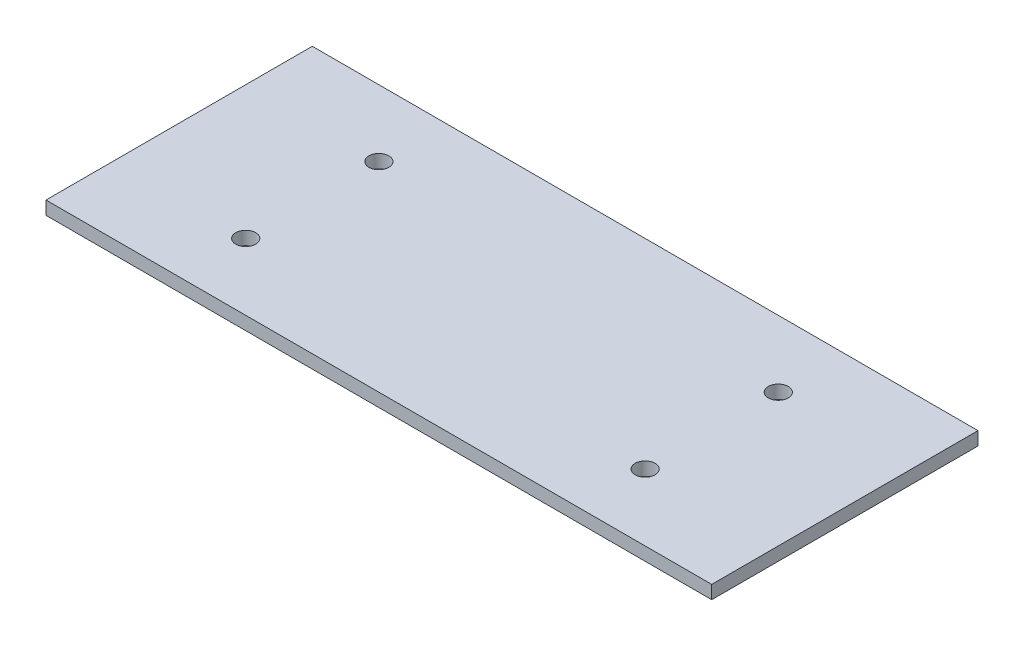
ISO-10303-21;
HEADER;
FILE_DESCRIPTION(('STEP AP214'),'2;1');
FILE_NAME('part.step','',(''),(''),'','','');
FILE_SCHEMA(('AUTOMOTIVE_DESIGN { 1 0 10303 214 1 1 1 1 }'));
ENDSEC;
DATA;
#1=APPLICATION_CONTEXT('core data for automotive mechanical design processes');
#2=APPLICATION_PROTOCOL_DEFINITION('international standard','automotive_design',2000,#1);
#3=PRODUCT_CONTEXT('',#1,'mechanical');
#4=PRODUCT('Part','Part','',(#3));
#5=PRODUCT_RELATED_PRODUCT_CATEGORY('part','',(#4));
#6=PRODUCT_DEFINITION_FORMATION('','',#4);
#7=PRODUCT_DEFINITION_CONTEXT('part definition',#1,'design');
#8=PRODUCT_DEFINITION('design','',#6,#7);
#9=PRODUCT_DEFINITION_SHAPE('','',#8);
#10=(LENGTH_UNIT() NAMED_UNIT(*) SI_UNIT(.MILLI.,.METRE.));
#11=(NAMED_UNIT(*) PLANE_ANGLE_UNIT() SI_UNIT($,.RADIAN.));
#12=(NAMED_UNIT(*) SI_UNIT($,.STERADIAN.) SOLID_ANGLE_UNIT());
#13=UNCERTAINTY_MEASURE_WITH_UNIT(LENGTH_MEASURE(1.E-05),#10,'distance_accuracy_value','');
#14=(GEOMETRIC_REPRESENTATION_CONTEXT(3) GLOBAL_UNCERTAINTY_ASSIGNED_CONTEXT((#13)) GLOBAL_UNIT_ASSIGNED_CONTEXT((#10,
#11,#12)) REPRESENTATION_CONTEXT('',''));
#15=CARTESIAN_POINT('',(0.,0.,0.));
#16=DIRECTION('',(0.,0.,1.));
#17=DIRECTION('',(1.,0.,0.));
#18=AXIS2_PLACEMENT_3D('',#15,#16,#17);
#19=CARTESIAN_POINT('',(0.,2.,-40.));
#20=DIRECTION('',(0.,0.,1.));
#21=DIRECTION('',(1.,0.,0.));
#22=AXIS2_PLACEMENT_3D('',#19,#20,#21);
#23=PLANE('',#22);
#24=DIRECTION('',(-1.,0.,0.));
#25=VECTOR('',#24,1.);
#26=CARTESIAN_POINT('',(0.,0.,-40.));
#27=LINE('',#26,#25);
#28=CARTESIAN_POINT('',(100.,0.,-40.));
#29=VERTEX_POINT('',#28);
#30=CARTESIAN_POINT('',(0.,0.,-40.));
#31=VERTEX_POINT('',#30);
#32=EDGE_CURVE('E127',#29,#31,#27,.T.);
#33=ORIENTED_EDGE('',*,*,#32,.T.);
#34=DIRECTION('',(0.,-1.,0.));
#35=VECTOR('',#34,1.);
#36=CARTESIAN_POINT('',(0.,2.,-40.));
#37=LINE('',#36,#35);
#38=CARTESIAN_POINT('',(0.,2.,-40.));
#39=VERTEX_POINT('',#38);
#40=EDGE_CURVE('E11',#39,#31,#37,.T.);
#41=ORIENTED_EDGE('',*,*,#40,.F.);
#42=DIRECTION('',(-1.,0.,0.));
#43=VECTOR('',#42,1.);
#44=CARTESIAN_POINT('',(0.,2.,-40.));
#45=LINE('',#44,#43);
#46=CARTESIAN_POINT('',(100.,2.,-40.));
#47=VERTEX_POINT('',#46);
#48=EDGE_CURVE('E95',#47,#39,#45,.T.);
#49=ORIENTED_EDGE('',*,*,#48,.F.);
#50=DIRECTION('',(0.,-1.,0.));
#51=VECTOR('',#50,1.);
#52=CARTESIAN_POINT('',(100.,2.,-40.));
#53=LINE('',#52,#51);
#54=EDGE_CURVE('E114',#47,#29,#53,.T.);
#55=ORIENTED_EDGE('',*,*,#54,.T.);
#56=EDGE_LOOP('',(#33,#41,#49,#55));
#57=FACE_BOUND('',#56,.T.);
#58=ADVANCED_FACE('F41',(#57),#23,.F.);
#59=CARTESIAN_POINT('',(0.,2.,0.));
#60=DIRECTION('',(1.,0.,0.));
#61=DIRECTION('',(0.,0.,-1.));
#62=AXIS2_PLACEMENT_3D('',#59,#60,#61);
#63=PLANE('',#62);
#64=DIRECTION('',(0.,0.,1.));
#65=VECTOR('',#64,1.);
#66=CARTESIAN_POINT('',(0.,0.,0.));
#67=LINE('',#66,#65);
#68=CARTESIAN_POINT('',(0.,0.,0.));
#69=VERTEX_POINT('',#68);
#70=EDGE_CURVE('E100',#31,#69,#67,.T.);
#71=ORIENTED_EDGE('',*,*,#70,.T.);
#72=DIRECTION('',(0.,-1.,0.));
#73=VECTOR('',#72,1.);
#74=CARTESIAN_POINT('',(0.,2.,0.));
#75=LINE('',#74,#73);
#76=CARTESIAN_POINT('',(0.,2.,0.));
#77=VERTEX_POINT('',#76);
#78=EDGE_CURVE('E51',#77,#69,#75,.T.);
#79=ORIENTED_EDGE('',*,*,#78,.F.);
#80=DIRECTION('',(0.,0.,1.));
#81=VECTOR('',#80,1.);
#82=CARTESIAN_POINT('',(0.,2.,0.));
#83=LINE('',#82,#81);
#84=EDGE_CURVE('E89',#39,#77,#83,.T.);
#85=ORIENTED_EDGE('',*,*,#84,.F.);
#86=ORIENTED_EDGE('',*,*,#40,.T.);
#87=EDGE_LOOP('',(#71,#79,#85,#86));
#88=FACE_BOUND('',#87,.T.);
#89=ADVANCED_FACE('F99',(#88),#63,.F.);
#90=CARTESIAN_POINT('',(0.,2.,0.));
#91=DIRECTION('',(0.,0.,-1.));
#92=DIRECTION('',(-1.,0.,0.));
#93=AXIS2_PLACEMENT_3D('',#90,#91,#92);
#94=PLANE('',#93);
#95=DIRECTION('',(1.,0.,0.));
#96=VECTOR('',#95,1.);
#97=CARTESIAN_POINT('',(0.,0.,0.));
#98=LINE('',#97,#96);
#99=CARTESIAN_POINT('',(100.,0.,0.));
#100=VERTEX_POINT('',#99);
#101=EDGE_CURVE('E76',#69,#100,#98,.T.);
#102=ORIENTED_EDGE('',*,*,#101,.T.);
#103=DIRECTION('',(0.,-1.,0.));
#104=VECTOR('',#103,1.);
#105=CARTESIAN_POINT('',(100.,2.,0.));
#106=LINE('',#105,#104);
#107=CARTESIAN_POINT('',(100.,2.,0.));
#108=VERTEX_POINT('',#107);
#109=EDGE_CURVE('E102',#108,#100,#106,.T.);
#110=ORIENTED_EDGE('',*,*,#109,.F.);
#111=DIRECTION('',(1.,0.,0.));
#112=VECTOR('',#111,1.);
#113=CARTESIAN_POINT('',(0.,2.,0.));
#114=LINE('',#113,#112);
#115=EDGE_CURVE('E93',#77,#108,#114,.T.);
#116=ORIENTED_EDGE('',*,*,#115,.F.);
#117=ORIENTED_EDGE('',*,*,#78,.T.);
#118=EDGE_LOOP('',(#102,#110,#116,#117));
#119=FACE_BOUND('',#118,.T.);
#120=ADVANCED_FACE('F103',(#119),#94,.F.);
#121=CARTESIAN_POINT('',(100.,2.,0.));
#122=DIRECTION('',(-1.,0.,0.));
#123=DIRECTION('',(0.,0.,1.));
#124=AXIS2_PLACEMENT_3D('',#121,#122,#123);
#125=PLANE('',#124);
#126=DIRECTION('',(0.,0.,-1.));
#127=VECTOR('',#126,1.);
#128=CARTESIAN_POINT('',(100.,0.,0.));
#129=LINE('',#128,#127);
#130=EDGE_CURVE('E82',#100,#29,#129,.T.);
#131=ORIENTED_EDGE('',*,*,#130,.T.);
#132=ORIENTED_EDGE('',*,*,#54,.F.);
#133=DIRECTION('',(0.,0.,-1.));
#134=VECTOR('',#133,1.);
#135=CARTESIAN_POINT('',(100.,2.,0.));
#136=LINE('',#135,#134);
#137=EDGE_CURVE('E59',#108,#47,#136,.T.);
#138=ORIENTED_EDGE('',*,*,#137,.F.);
#139=ORIENTED_EDGE('',*,*,#109,.T.);
#140=EDGE_LOOP('',(#131,#132,#138,#139));
#141=FACE_BOUND('',#140,.T.);
#142=ADVANCED_FACE('F145',(#141),#125,.F.);
#143=CARTESIAN_POINT('',(20.,2.,-30.));
#144=DIRECTION('',(0.,-1.,0.));
#145=DIRECTION('',(0.,0.,-1.));
#146=AXIS2_PLACEMENT_3D('',#143,#144,#145);
#147=CYLINDRICAL_SURFACE('',#146,1.5);
#148=CARTESIAN_POINT('',(20.,2.,-30.));
#149=DIRECTION('',(0.,1.,0.));
#150=DIRECTION('',(0.,0.,1.));
#151=AXIS2_PLACEMENT_3D('',#148,#149,#150);
#152=CIRCLE('',#151,1.5);
#153=CARTESIAN_POINT('',(20.,2.,-28.5));
#154=VERTEX_POINT('',#153);
#155=EDGE_CURVE('E152',#154,#154,#152,.F.);
#156=ORIENTED_EDGE('',*,*,#155,.F.);
#157=EDGE_LOOP('',(#156));
#158=FACE_BOUND('',#157,.T.);
#159=CARTESIAN_POINT('',(20.,0.,-30.));
#160=DIRECTION('',(0.,1.,0.));
#161=DIRECTION('',(0.,0.,1.));
#162=AXIS2_PLACEMENT_3D('',#159,#160,#161);
#163=CIRCLE('',#162,1.5);
#164=CARTESIAN_POINT('',(20.,0.,-28.5));
#165=VERTEX_POINT('',#164);
#166=EDGE_CURVE('E123',#165,#165,#163,.F.);
#167=ORIENTED_EDGE('',*,*,#166,.T.);
#168=EDGE_LOOP('',(#167));
#169=FACE_BOUND('',#168,.T.);
#170=ADVANCED_FACE('F175',(#158,#169),#147,.F.);
#171=CARTESIAN_POINT('',(20.,2.,-10.));
#172=DIRECTION('',(0.,-1.,0.));
#173=DIRECTION('',(0.,0.,-1.));
#174=AXIS2_PLACEMENT_3D('',#171,#172,#173);
#175=CYLINDRICAL_SURFACE('',#174,1.5);
#176=CARTESIAN_POINT('',(20.,2.,-10.));
#177=DIRECTION('',(0.,1.,0.));
#178=DIRECTION('',(0.,0.,1.));
#179=AXIS2_PLACEMENT_3D('',#176,#177,#178);
#180=CIRCLE('',#179,1.5);
#181=CARTESIAN_POINT('',(20.,2.,-8.50000000000001));
#182=VERTEX_POINT('',#181);
#183=EDGE_CURVE('E155',#182,#182,#180,.T.);
#184=ORIENTED_EDGE('',*,*,#183,.T.);
#185=EDGE_LOOP('',(#184));
#186=FACE_BOUND('',#185,.T.);
#187=CARTESIAN_POINT('',(20.,0.,-10.));
#188=DIRECTION('',(0.,1.,0.));
#189=DIRECTION('',(0.,0.,1.));
#190=AXIS2_PLACEMENT_3D('',#187,#188,#189);
#191=CIRCLE('',#190,1.5);
#192=CARTESIAN_POINT('',(20.,0.,-8.50000000000001));
#193=VERTEX_POINT('',#192);
#194=EDGE_CURVE('E119',#193,#193,#191,.T.);
#195=ORIENTED_EDGE('',*,*,#194,.F.);
#196=EDGE_LOOP('',(#195));
#197=FACE_BOUND('',#196,.T.);
#198=ADVANCED_FACE('F178',(#186,#197),#175,.F.);
#199=CARTESIAN_POINT('',(80.,2.,-30.));
#200=DIRECTION('',(0.,-1.,0.));
#201=DIRECTION('',(0.,0.,-1.));
#202=AXIS2_PLACEMENT_3D('',#199,#200,#201);
#203=CYLINDRICAL_SURFACE('',#202,1.5);
#204=CARTESIAN_POINT('',(80.,2.,-30.));
#205=DIRECTION('',(0.,1.,0.));
#206=DIRECTION('',(0.,0.,1.));
#207=AXIS2_PLACEMENT_3D('',#204,#205,#206);
#208=CIRCLE('',#207,1.5);
#209=CARTESIAN_POINT('',(80.,2.,-28.5));
#210=VERTEX_POINT('',#209);
#211=EDGE_CURVE('E141',#210,#210,#208,.T.);
#212=ORIENTED_EDGE('',*,*,#211,.T.);
#213=EDGE_LOOP('',(#212));
#214=FACE_BOUND('',#213,.T.);
#215=CARTESIAN_POINT('',(80.,0.,-30.));
#216=DIRECTION('',(0.,1.,0.));
#217=DIRECTION('',(0.,0.,1.));
#218=AXIS2_PLACEMENT_3D('',#215,#216,#217);
#219=CIRCLE('',#218,1.5);
#220=CARTESIAN_POINT('',(80.,0.,-28.5));
#221=VERTEX_POINT('',#220);
#222=EDGE_CURVE('E115',#221,#221,#219,.T.);
#223=ORIENTED_EDGE('',*,*,#222,.F.);
#224=EDGE_LOOP('',(#223));
#225=FACE_BOUND('',#224,.T.);
#226=ADVANCED_FACE('F43',(#214,#225),#203,.F.);
#227=CARTESIAN_POINT('',(80.,2.,-10.0000000000001));
#228=DIRECTION('',(0.,-1.,0.));
#229=DIRECTION('',(0.,0.,-1.));
#230=AXIS2_PLACEMENT_3D('',#227,#228,#229);
#231=CYLINDRICAL_SURFACE('',#230,1.5);
#232=CARTESIAN_POINT('',(80.,2.,-10.0000000000001));
#233=DIRECTION('',(0.,1.,0.));
#234=DIRECTION('',(0.,0.,1.));
#235=AXIS2_PLACEMENT_3D('',#232,#233,#234);
#236=CIRCLE('',#235,1.5);
#237=CARTESIAN_POINT('',(80.,2.,-8.50000000000006));
#238=VERTEX_POINT('',#237);
#239=EDGE_CURVE('E107',#238,#238,#236,.F.);
#240=ORIENTED_EDGE('',*,*,#239,.F.);
#241=EDGE_LOOP('',(#240));
#242=FACE_BOUND('',#241,.T.);
#243=CARTESIAN_POINT('',(80.,0.,-10.0000000000001));
#244=DIRECTION('',(0.,1.,0.));
#245=DIRECTION('',(0.,0.,1.));
#246=AXIS2_PLACEMENT_3D('',#243,#244,#245);
#247=CIRCLE('',#246,1.5);
#248=CARTESIAN_POINT('',(80.,0.,-8.50000000000006));
#249=VERTEX_POINT('',#248);
#250=EDGE_CURVE('E137',#249,#249,#247,.F.);
#251=ORIENTED_EDGE('',*,*,#250,.T.);
#252=EDGE_LOOP('',(#251));
#253=FACE_BOUND('',#252,.T.);
#254=ADVANCED_FACE('F169',(#242,#253),#231,.F.);
#255=CARTESIAN_POINT('',(0.,2.,0.));
#256=DIRECTION('',(0.,1.,0.));
#257=DIRECTION('',(0.,0.,1.));
#258=AXIS2_PLACEMENT_3D('',#255,#256,#257);
#259=PLANE('',#258);
#260=ORIENTED_EDGE('',*,*,#211,.F.);
#261=EDGE_LOOP('',(#260));
#262=FACE_BOUND('',#261,.T.);
#263=ORIENTED_EDGE('',*,*,#183,.F.);
#264=EDGE_LOOP('',(#263));
#265=FACE_BOUND('',#264,.T.);
#266=ORIENTED_EDGE('',*,*,#155,.T.);
#267=EDGE_LOOP('',(#266));
#268=FACE_BOUND('',#267,.T.);
#269=ORIENTED_EDGE('',*,*,#48,.T.);
#270=ORIENTED_EDGE('',*,*,#84,.T.);
#271=ORIENTED_EDGE('',*,*,#115,.T.);
#272=ORIENTED_EDGE('',*,*,#137,.T.);
#273=EDGE_LOOP('',(#269,#270,#271,#272));
#274=FACE_BOUND('',#273,.T.);
#275=ORIENTED_EDGE('',*,*,#239,.T.);
#276=EDGE_LOOP('',(#275));
#277=FACE_BOUND('',#276,.T.);
#278=ADVANCED_FACE('F90',(#262,#265,#268,#274,#277),#259,.T.);
#279=CARTESIAN_POINT('',(0.,0.,0.));
#280=DIRECTION('',(0.,1.,0.));
#281=DIRECTION('',(0.,0.,1.));
#282=AXIS2_PLACEMENT_3D('',#279,#280,#281);
#283=PLANE('',#282);
#284=ORIENTED_EDGE('',*,*,#222,.T.);
#285=EDGE_LOOP('',(#284));
#286=FACE_BOUND('',#285,.T.);
#287=ORIENTED_EDGE('',*,*,#194,.T.);
#288=EDGE_LOOP('',(#287));
#289=FACE_BOUND('',#288,.T.);
#290=ORIENTED_EDGE('',*,*,#166,.F.);
#291=EDGE_LOOP('',(#290));
#292=FACE_BOUND('',#291,.T.);
#293=ORIENTED_EDGE('',*,*,#32,.F.);
#294=ORIENTED_EDGE('',*,*,#130,.F.);
#295=ORIENTED_EDGE('',*,*,#101,.F.);
#296=ORIENTED_EDGE('',*,*,#70,.F.);
#297=EDGE_LOOP('',(#293,#294,#295,#296));
#298=FACE_BOUND('',#297,.T.);
#299=ORIENTED_EDGE('',*,*,#250,.F.);
#300=EDGE_LOOP('',(#299));
#301=FACE_BOUND('',#300,.T.);
#302=ADVANCED_FACE('F148',(#286,#289,#292,#298,#301),#283,.F.);
#303=CLOSED_SHELL('',(#58,#89,#120,#142,#170,#198,#226,#254,#278,#302));
#304=MANIFOLD_SOLID_BREP('B2',#303);
#305=ADVANCED_BREP_SHAPE_REPRESENTATION('',(#18,#304),#14);
#306=SHAPE_DEFINITION_REPRESENTATION(#9,#305);
ENDSEC;
END-ISO-10303-21;
